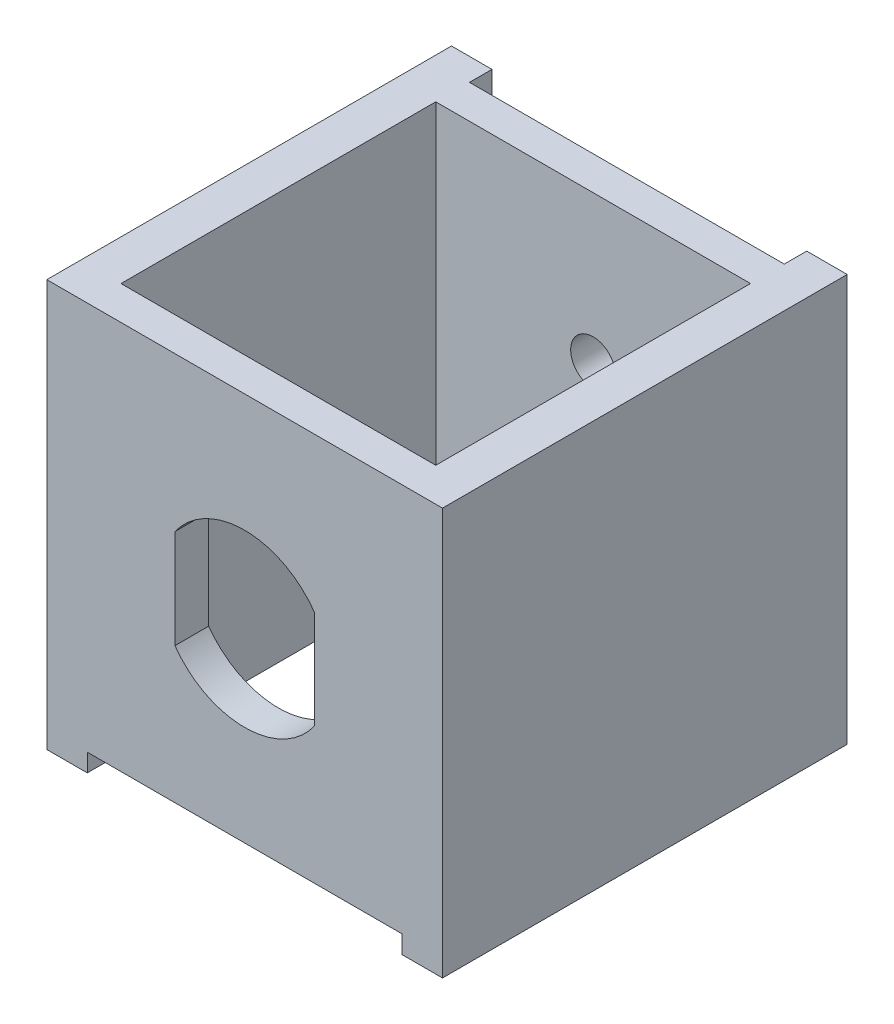
ISO-10303-21;
HEADER;
FILE_DESCRIPTION(('STEP AP214'),'2;1');
FILE_NAME('part.step','',(''),(''),'','','');
FILE_SCHEMA(('AUTOMOTIVE_DESIGN { 1 0 10303 214 1 1 1 1 }'));
ENDSEC;
DATA;
#1=APPLICATION_CONTEXT('core data for automotive mechanical design processes');
#2=APPLICATION_PROTOCOL_DEFINITION('international standard','automotive_design',2000,#1);
#3=PRODUCT_CONTEXT('',#1,'mechanical');
#4=PRODUCT('Part','Part','',(#3));
#5=PRODUCT_RELATED_PRODUCT_CATEGORY('part','',(#4));
#6=PRODUCT_DEFINITION_FORMATION('','',#4);
#7=PRODUCT_DEFINITION_CONTEXT('part definition',#1,'design');
#8=PRODUCT_DEFINITION('design','',#6,#7);
#9=PRODUCT_DEFINITION_SHAPE('','',#8);
#10=(LENGTH_UNIT() NAMED_UNIT(*) SI_UNIT(.MILLI.,.METRE.));
#11=(NAMED_UNIT(*) PLANE_ANGLE_UNIT() SI_UNIT($,.RADIAN.));
#12=(NAMED_UNIT(*) SI_UNIT($,.STERADIAN.) SOLID_ANGLE_UNIT());
#13=UNCERTAINTY_MEASURE_WITH_UNIT(LENGTH_MEASURE(1.E-05),#10,'distance_accuracy_value','');
#14=(GEOMETRIC_REPRESENTATION_CONTEXT(3) GLOBAL_UNCERTAINTY_ASSIGNED_CONTEXT((#13)) GLOBAL_UNIT_ASSIGNED_CONTEXT((#10,
#11,#12)) REPRESENTATION_CONTEXT('',''));
#15=CARTESIAN_POINT('',(0.,0.,0.));
#16=DIRECTION('',(0.,0.,1.));
#17=DIRECTION('',(1.,0.,0.));
#18=AXIS2_PLACEMENT_3D('',#15,#16,#17);
#19=CARTESIAN_POINT('',(-8.8,9.05,-18.));
#20=DIRECTION('',(-1.,0.,0.));
#21=DIRECTION('',(0.,-1.,0.));
#22=AXIS2_PLACEMENT_3D('',#19,#20,#21);
#23=PLANE('',#22);
#24=DIRECTION('',(0.,-1.,0.));
#25=VECTOR('',#24,1.);
#26=CARTESIAN_POINT('',(-8.8,9.05,0.));
#27=LINE('',#26,#25);
#28=CARTESIAN_POINT('',(-8.8,9.05,0.));
#29=VERTEX_POINT('',#28);
#30=CARTESIAN_POINT('',(-8.8,-9.05,0.));
#31=VERTEX_POINT('',#30);
#32=EDGE_CURVE('E246',#29,#31,#27,.T.);
#33=ORIENTED_EDGE('',*,*,#32,.F.);
#34=DIRECTION('',(0.,0.,1.));
#35=VECTOR('',#34,1.);
#36=CARTESIAN_POINT('',(-8.8,9.05,-18.));
#37=LINE('',#36,#35);
#38=CARTESIAN_POINT('',(-8.8,9.05,-18.));
#39=VERTEX_POINT('',#38);
#40=EDGE_CURVE('E257',#39,#29,#37,.T.);
#41=ORIENTED_EDGE('',*,*,#40,.F.);
#42=DIRECTION('',(0.,-1.,0.));
#43=VECTOR('',#42,1.);
#44=CARTESIAN_POINT('',(-8.8,9.05,-18.));
#45=LINE('',#44,#43);
#46=CARTESIAN_POINT('',(-8.8,-9.05,-18.));
#47=VERTEX_POINT('',#46);
#48=EDGE_CURVE('E235',#39,#47,#45,.T.);
#49=ORIENTED_EDGE('',*,*,#48,.T.);
#50=DIRECTION('',(0.,0.,1.));
#51=VECTOR('',#50,1.);
#52=CARTESIAN_POINT('',(-8.8,-9.05,-18.));
#53=LINE('',#52,#51);
#54=EDGE_CURVE('E255',#47,#31,#53,.T.);
#55=ORIENTED_EDGE('',*,*,#54,.T.);
#56=EDGE_LOOP('',(#33,#41,#49,#55));
#57=FACE_BOUND('',#56,.T.);
#58=DIRECTION('',(0.,0.,-1.));
#59=VECTOR('',#58,1.);
#60=CARTESIAN_POINT('',(-8.8,-1.5,-11.5));
#61=LINE('',#60,#59);
#62=CARTESIAN_POINT('',(-8.8,-1.5,-6.5));
#63=VERTEX_POINT('',#62);
#64=CARTESIAN_POINT('',(-8.8,-1.5,-11.5));
#65=VERTEX_POINT('',#64);
#66=EDGE_CURVE('E202',#63,#65,#61,.T.);
#67=ORIENTED_EDGE('',*,*,#66,.T.);
#68=DIRECTION('',(0.,1.,0.));
#69=VECTOR('',#68,1.);
#70=CARTESIAN_POINT('',(-8.8,1.5,-11.5));
#71=LINE('',#70,#69);
#72=CARTESIAN_POINT('',(-8.8,1.5,-11.5));
#73=VERTEX_POINT('',#72);
#74=EDGE_CURVE('E215',#65,#73,#71,.T.);
#75=ORIENTED_EDGE('',*,*,#74,.T.);
#76=DIRECTION('',(0.,0.,1.));
#77=VECTOR('',#76,1.);
#78=CARTESIAN_POINT('',(-8.8,1.5,-11.5));
#79=LINE('',#78,#77);
#80=CARTESIAN_POINT('',(-8.8,1.5,-6.5));
#81=VERTEX_POINT('',#80);
#82=EDGE_CURVE('E203',#73,#81,#79,.T.);
#83=ORIENTED_EDGE('',*,*,#82,.T.);
#84=DIRECTION('',(0.,-1.,0.));
#85=VECTOR('',#84,1.);
#86=CARTESIAN_POINT('',(-8.8,1.5,-6.5));
#87=LINE('',#86,#85);
#88=EDGE_CURVE('E194',#81,#63,#87,.T.);
#89=ORIENTED_EDGE('',*,*,#88,.T.);
#90=EDGE_LOOP('',(#67,#75,#83,#89));
#91=FACE_BOUND('',#90,.T.);
#92=ADVANCED_FACE('F34',(#57,#91),#23,.T.);
#93=CARTESIAN_POINT('',(0.,0.,-1.5));
#94=DIRECTION('',(0.,0.,1.));
#95=DIRECTION('',(1.,0.,0.));
#96=AXIS2_PLACEMENT_3D('',#93,#94,#95);
#97=PLANE('',#96);
#98=DIRECTION('',(0.,-1.,0.));
#99=VECTOR('',#98,1.);
#100=CARTESIAN_POINT('',(-3.1,2.1977260975836,-1.5));
#101=LINE('',#100,#99);
#102=CARTESIAN_POINT('',(-3.1,2.1977260975836,-1.5));
#103=VERTEX_POINT('',#102);
#104=CARTESIAN_POINT('',(-3.1,-2.19772609758359,-1.5));
#105=VERTEX_POINT('',#104);
#106=EDGE_CURVE('E339',#103,#105,#101,.T.);
#107=ORIENTED_EDGE('',*,*,#106,.T.);
#108=CARTESIAN_POINT('',(0.,0.,-1.5));
#109=DIRECTION('',(0.,0.,1.));
#110=DIRECTION('',(1.,0.,0.));
#111=AXIS2_PLACEMENT_3D('',#108,#109,#110);
#112=CIRCLE('',#111,3.8);
#113=CARTESIAN_POINT('',(3.1,-2.1977260975836,-1.5));
#114=VERTEX_POINT('',#113);
#115=EDGE_CURVE('E329',#105,#114,#112,.T.);
#116=ORIENTED_EDGE('',*,*,#115,.T.);
#117=DIRECTION('',(0.,1.,0.));
#118=VECTOR('',#117,1.);
#119=CARTESIAN_POINT('',(3.1,-2.1977260975836,-1.5));
#120=LINE('',#119,#118);
#121=CARTESIAN_POINT('',(3.1,2.19772609758359,-1.5));
#122=VERTEX_POINT('',#121);
#123=EDGE_CURVE('E332',#114,#122,#120,.T.);
#124=ORIENTED_EDGE('',*,*,#123,.T.);
#125=CARTESIAN_POINT('',(0.,0.,-1.5));
#126=DIRECTION('',(0.,0.,1.));
#127=DIRECTION('',(1.,0.,0.));
#128=AXIS2_PLACEMENT_3D('',#125,#126,#127);
#129=CIRCLE('',#128,3.8);
#130=EDGE_CURVE('E336',#122,#103,#129,.T.);
#131=ORIENTED_EDGE('',*,*,#130,.T.);
#132=EDGE_LOOP('',(#107,#116,#124,#131));
#133=FACE_BOUND('',#132,.T.);
#134=DIRECTION('',(-1.,0.,0.));
#135=VECTOR('',#134,1.);
#136=CARTESIAN_POINT('',(0.,9.05,-1.5));
#137=LINE('',#136,#135);
#138=CARTESIAN_POINT('',(7.,9.05,-1.5));
#139=VERTEX_POINT('',#138);
#140=CARTESIAN_POINT('',(-7.,9.05,-1.5));
#141=VERTEX_POINT('',#140);
#142=EDGE_CURVE('E270',#139,#141,#137,.T.);
#143=ORIENTED_EDGE('',*,*,#142,.F.);
#144=DIRECTION('',(0.,-1.,0.));
#145=VECTOR('',#144,1.);
#146=CARTESIAN_POINT('',(7.,0.,-1.5));
#147=LINE('',#146,#145);
#148=CARTESIAN_POINT('',(7.,-8.25,-1.5));
#149=VERTEX_POINT('',#148);
#150=EDGE_CURVE('E320',#139,#149,#147,.T.);
#151=ORIENTED_EDGE('',*,*,#150,.T.);
#152=DIRECTION('',(1.,0.,0.));
#153=VECTOR('',#152,1.);
#154=CARTESIAN_POINT('',(-7.,-8.25,-1.5));
#155=LINE('',#154,#153);
#156=CARTESIAN_POINT('',(-7.,-8.25,-1.5));
#157=VERTEX_POINT('',#156);
#158=EDGE_CURVE('E280',#157,#149,#155,.T.);
#159=ORIENTED_EDGE('',*,*,#158,.F.);
#160=DIRECTION('',(0.,1.,0.));
#161=VECTOR('',#160,1.);
#162=CARTESIAN_POINT('',(-7.,0.,-1.5));
#163=LINE('',#162,#161);
#164=EDGE_CURVE('E325',#157,#141,#163,.T.);
#165=ORIENTED_EDGE('',*,*,#164,.T.);
#166=EDGE_LOOP('',(#143,#151,#159,#165));
#167=FACE_BOUND('',#166,.T.);
#168=ADVANCED_FACE('F405',(#133,#167),#97,.F.);
#169=CARTESIAN_POINT('',(0.,0.,0.));
#170=DIRECTION('',(0.,0.,1.));
#171=DIRECTION('',(1.,0.,0.));
#172=AXIS2_PLACEMENT_3D('',#169,#170,#171);
#173=PLANE('',#172);
#174=CARTESIAN_POINT('',(0.,0.,0.));
#175=DIRECTION('',(0.,0.,1.));
#176=DIRECTION('',(1.,0.,0.));
#177=AXIS2_PLACEMENT_3D('',#174,#175,#176);
#178=CIRCLE('',#177,3.8);
#179=CARTESIAN_POINT('',(-3.1,-2.19772609758359,0.));
#180=VERTEX_POINT('',#179);
#181=CARTESIAN_POINT('',(3.1,-2.1977260975836,0.));
#182=VERTEX_POINT('',#181);
#183=EDGE_CURVE('E328',#180,#182,#178,.T.);
#184=ORIENTED_EDGE('',*,*,#183,.F.);
#185=DIRECTION('',(0.,-1.,0.));
#186=VECTOR('',#185,1.);
#187=CARTESIAN_POINT('',(-3.1,2.1977260975836,0.));
#188=LINE('',#187,#186);
#189=CARTESIAN_POINT('',(-3.1,2.1977260975836,0.));
#190=VERTEX_POINT('',#189);
#191=EDGE_CURVE('E333',#190,#180,#188,.T.);
#192=ORIENTED_EDGE('',*,*,#191,.F.);
#193=CARTESIAN_POINT('',(0.,0.,0.));
#194=DIRECTION('',(0.,0.,1.));
#195=DIRECTION('',(1.,0.,0.));
#196=AXIS2_PLACEMENT_3D('',#193,#194,#195);
#197=CIRCLE('',#196,3.8);
#198=CARTESIAN_POINT('',(3.1,2.19772609758359,0.));
#199=VERTEX_POINT('',#198);
#200=EDGE_CURVE('E347',#199,#190,#197,.T.);
#201=ORIENTED_EDGE('',*,*,#200,.F.);
#202=DIRECTION('',(0.,1.,0.));
#203=VECTOR('',#202,1.);
#204=CARTESIAN_POINT('',(3.1,-2.1977260975836,0.));
#205=LINE('',#204,#203);
#206=EDGE_CURVE('E344',#182,#199,#205,.T.);
#207=ORIENTED_EDGE('',*,*,#206,.F.);
#208=EDGE_LOOP('',(#184,#192,#201,#207));
#209=FACE_BOUND('',#208,.T.);
#210=DIRECTION('',(0.,-1.,0.));
#211=VECTOR('',#210,1.);
#212=CARTESIAN_POINT('',(7.,-8.25,0.));
#213=LINE('',#212,#211);
#214=CARTESIAN_POINT('',(7.,-8.25,0.));
#215=VERTEX_POINT('',#214);
#216=CARTESIAN_POINT('',(7.,-9.05,0.));
#217=VERTEX_POINT('',#216);
#218=EDGE_CURVE('E289',#215,#217,#213,.T.);
#219=ORIENTED_EDGE('',*,*,#218,.T.);
#220=DIRECTION('',(1.,0.,0.));
#221=VECTOR('',#220,1.);
#222=CARTESIAN_POINT('',(-8.8,-9.05,0.));
#223=LINE('',#222,#221);
#224=CARTESIAN_POINT('',(8.8,-9.05,0.));
#225=VERTEX_POINT('',#224);
#226=EDGE_CURVE('E249',#217,#225,#223,.T.);
#227=ORIENTED_EDGE('',*,*,#226,.T.);
#228=DIRECTION('',(0.,1.,0.));
#229=VECTOR('',#228,1.);
#230=CARTESIAN_POINT('',(8.8,-9.05,0.));
#231=LINE('',#230,#229);
#232=CARTESIAN_POINT('',(8.8,9.05,0.));
#233=VERTEX_POINT('',#232);
#234=EDGE_CURVE('E223',#225,#233,#231,.T.);
#235=ORIENTED_EDGE('',*,*,#234,.T.);
#236=DIRECTION('',(-1.,0.,0.));
#237=VECTOR('',#236,1.);
#238=CARTESIAN_POINT('',(8.8,9.05,0.));
#239=LINE('',#238,#237);
#240=EDGE_CURVE('E243',#233,#29,#239,.T.);
#241=ORIENTED_EDGE('',*,*,#240,.T.);
#242=ORIENTED_EDGE('',*,*,#32,.T.);
#243=CARTESIAN_POINT('',(-7.,-9.05,0.));
#244=VERTEX_POINT('',#243);
#245=EDGE_CURVE('E232',#31,#244,#223,.T.);
#246=ORIENTED_EDGE('',*,*,#245,.T.);
#247=DIRECTION('',(0.,-1.,0.));
#248=VECTOR('',#247,1.);
#249=CARTESIAN_POINT('',(-7.,-8.25,0.));
#250=LINE('',#249,#248);
#251=CARTESIAN_POINT('',(-7.,-8.25,0.));
#252=VERTEX_POINT('',#251);
#253=EDGE_CURVE('E290',#252,#244,#250,.T.);
#254=ORIENTED_EDGE('',*,*,#253,.F.);
#255=DIRECTION('',(-1.,0.,0.));
#256=VECTOR('',#255,1.);
#257=CARTESIAN_POINT('',(-7.,-8.25,0.));
#258=LINE('',#257,#256);
#259=EDGE_CURVE('E286',#215,#252,#258,.T.);
#260=ORIENTED_EDGE('',*,*,#259,.F.);
#261=EDGE_LOOP('',(#219,#227,#235,#241,#242,#246,#254,#260));
#262=FACE_BOUND('',#261,.T.);
#263=ADVANCED_FACE('F411',(#209,#262),#173,.T.);
#264=CARTESIAN_POINT('',(-7.,9.25,-18.));
#265=DIRECTION('',(1.,0.,0.));
#266=DIRECTION('',(0.,1.,0.));
#267=AXIS2_PLACEMENT_3D('',#264,#265,#266);
#268=PLANE('',#267);
#269=ORIENTED_EDGE('',*,*,#253,.T.);
#270=DIRECTION('',(0.,0.,-1.));
#271=VECTOR('',#270,1.);
#272=CARTESIAN_POINT('',(-7.,-9.05,-18.));
#273=LINE('',#272,#271);
#274=CARTESIAN_POINT('',(-7.,-9.05,-18.));
#275=VERTEX_POINT('',#274);
#276=EDGE_CURVE('E275',#244,#275,#273,.T.);
#277=ORIENTED_EDGE('',*,*,#276,.T.);
#278=DIRECTION('',(0.,1.,0.));
#279=VECTOR('',#278,1.);
#280=CARTESIAN_POINT('',(-7.,9.25,-18.));
#281=LINE('',#280,#279);
#282=CARTESIAN_POINT('',(-7.,9.05,-18.));
#283=VERTEX_POINT('',#282);
#284=EDGE_CURVE('E322',#275,#283,#281,.T.);
#285=ORIENTED_EDGE('',*,*,#284,.T.);
#286=DIRECTION('',(0.,0.,1.));
#287=VECTOR('',#286,1.);
#288=CARTESIAN_POINT('',(-7.,9.05,-18.));
#289=LINE('',#288,#287);
#290=CARTESIAN_POINT('',(-7.,9.05,-17.));
#291=VERTEX_POINT('',#290);
#292=EDGE_CURVE('E262',#283,#291,#289,.T.);
#293=ORIENTED_EDGE('',*,*,#292,.T.);
#294=DIRECTION('',(0.,1.,0.));
#295=VECTOR('',#294,1.);
#296=CARTESIAN_POINT('',(-7.,9.25,-17.));
#297=LINE('',#296,#295);
#298=CARTESIAN_POINT('',(-7.,-5.75,-17.));
#299=VERTEX_POINT('',#298);
#300=EDGE_CURVE('E312',#299,#291,#297,.T.);
#301=ORIENTED_EDGE('',*,*,#300,.F.);
#302=DIRECTION('',(0.,0.,-1.));
#303=VECTOR('',#302,1.);
#304=CARTESIAN_POINT('',(-7.,-5.75,-18.));
#305=LINE('',#304,#303);
#306=CARTESIAN_POINT('',(-7.,-5.75,-15.5));
#307=VERTEX_POINT('',#306);
#308=EDGE_CURVE('E309',#307,#299,#305,.T.);
#309=ORIENTED_EDGE('',*,*,#308,.F.);
#310=DIRECTION('',(0.,-1.,0.));
#311=VECTOR('',#310,1.);
#312=CARTESIAN_POINT('',(-7.,9.25,-15.5));
#313=LINE('',#312,#311);
#314=CARTESIAN_POINT('',(-7.,9.05,-15.5));
#315=VERTEX_POINT('',#314);
#316=EDGE_CURVE('E315',#315,#307,#313,.T.);
#317=ORIENTED_EDGE('',*,*,#316,.F.);
#318=EDGE_CURVE('E267',#315,#141,#289,.T.);
#319=ORIENTED_EDGE('',*,*,#318,.T.);
#320=ORIENTED_EDGE('',*,*,#164,.F.);
#321=DIRECTION('',(0.,0.,-1.));
#322=VECTOR('',#321,1.);
#323=CARTESIAN_POINT('',(-7.,-8.25,-1.5));
#324=LINE('',#323,#322);
#325=EDGE_CURVE('E278',#252,#157,#324,.T.);
#326=ORIENTED_EDGE('',*,*,#325,.F.);
#327=EDGE_LOOP('',(#269,#277,#285,#293,#301,#309,#317,#319,#320,#326));
#328=FACE_BOUND('',#327,.T.);
#329=ADVANCED_FACE('F465',(#328),#268,.T.);
#330=CARTESIAN_POINT('',(0.,0.,-18.));
#331=DIRECTION('',(0.,0.,1.));
#332=DIRECTION('',(1.,0.,0.));
#333=AXIS2_PLACEMENT_3D('',#330,#331,#332);
#334=PLANE('',#333);
#335=DIRECTION('',(1.,0.,0.));
#336=VECTOR('',#335,1.);
#337=CARTESIAN_POINT('',(-8.8,-9.05,-18.));
#338=LINE('',#337,#336);
#339=EDGE_CURVE('E238',#47,#275,#338,.T.);
#340=ORIENTED_EDGE('',*,*,#339,.F.);
#341=ORIENTED_EDGE('',*,*,#48,.F.);
#342=DIRECTION('',(-1.,0.,0.));
#343=VECTOR('',#342,1.);
#344=CARTESIAN_POINT('',(8.8,9.05,-18.));
#345=LINE('',#344,#343);
#346=EDGE_CURVE('E231',#283,#39,#345,.T.);
#347=ORIENTED_EDGE('',*,*,#346,.F.);
#348=ORIENTED_EDGE('',*,*,#284,.F.);
#349=EDGE_LOOP('',(#340,#341,#347,#348));
#350=FACE_BOUND('',#349,.T.);
#351=ADVANCED_FACE('F461',(#350),#334,.F.);
#352=CARTESIAN_POINT('',(7.,9.25,-18.));
#353=DIRECTION('',(-1.,0.,0.));
#354=DIRECTION('',(0.,-1.,0.));
#355=AXIS2_PLACEMENT_3D('',#352,#353,#354);
#356=PLANE('',#355);
#357=DIRECTION('',(0.,-1.,0.));
#358=VECTOR('',#357,1.);
#359=CARTESIAN_POINT('',(7.,9.25,-18.));
#360=LINE('',#359,#358);
#361=CARTESIAN_POINT('',(7.,9.05,-18.));
#362=VERTEX_POINT('',#361);
#363=CARTESIAN_POINT('',(7.,-9.05,-18.));
#364=VERTEX_POINT('',#363);
#365=EDGE_CURVE('E317',#362,#364,#360,.T.);
#366=ORIENTED_EDGE('',*,*,#365,.T.);
#367=DIRECTION('',(0.,0.,1.));
#368=VECTOR('',#367,1.);
#369=CARTESIAN_POINT('',(7.,-9.05,-18.));
#370=LINE('',#369,#368);
#371=EDGE_CURVE('E272',#364,#217,#370,.T.);
#372=ORIENTED_EDGE('',*,*,#371,.T.);
#373=ORIENTED_EDGE('',*,*,#218,.F.);
#374=DIRECTION('',(0.,0.,1.));
#375=VECTOR('',#374,1.);
#376=CARTESIAN_POINT('',(7.,-8.25,-1.5));
#377=LINE('',#376,#375);
#378=EDGE_CURVE('E283',#149,#215,#377,.T.);
#379=ORIENTED_EDGE('',*,*,#378,.F.);
#380=ORIENTED_EDGE('',*,*,#150,.F.);
#381=DIRECTION('',(0.,0.,-1.));
#382=VECTOR('',#381,1.);
#383=CARTESIAN_POINT('',(7.,9.05,-18.));
#384=LINE('',#383,#382);
#385=CARTESIAN_POINT('',(7.,9.05,-15.5));
#386=VERTEX_POINT('',#385);
#387=EDGE_CURVE('E263',#139,#386,#384,.T.);
#388=ORIENTED_EDGE('',*,*,#387,.T.);
#389=DIRECTION('',(0.,1.,0.));
#390=VECTOR('',#389,1.);
#391=CARTESIAN_POINT('',(7.,9.25,-15.5));
#392=LINE('',#391,#390);
#393=CARTESIAN_POINT('',(7.,-5.75,-15.5));
#394=VERTEX_POINT('',#393);
#395=EDGE_CURVE('E364',#394,#386,#392,.T.);
#396=ORIENTED_EDGE('',*,*,#395,.F.);
#397=DIRECTION('',(0.,0.,1.));
#398=VECTOR('',#397,1.);
#399=CARTESIAN_POINT('',(7.,-5.75,-18.));
#400=LINE('',#399,#398);
#401=CARTESIAN_POINT('',(7.,-5.75,-17.));
#402=VERTEX_POINT('',#401);
#403=EDGE_CURVE('E354',#402,#394,#400,.T.);
#404=ORIENTED_EDGE('',*,*,#403,.F.);
#405=DIRECTION('',(0.,-1.,0.));
#406=VECTOR('',#405,1.);
#407=CARTESIAN_POINT('',(7.,9.25,-17.));
#408=LINE('',#407,#406);
#409=CARTESIAN_POINT('',(7.,9.05,-17.));
#410=VERTEX_POINT('',#409);
#411=EDGE_CURVE('E362',#410,#402,#408,.T.);
#412=ORIENTED_EDGE('',*,*,#411,.F.);
#413=EDGE_CURVE('E254',#410,#362,#384,.T.);
#414=ORIENTED_EDGE('',*,*,#413,.T.);
#415=EDGE_LOOP('',(#366,#372,#373,#379,#380,#388,#396,#404,#412,#414));
#416=FACE_BOUND('',#415,.T.);
#417=ADVANCED_FACE('F457',(#416),#356,.T.);
#418=CARTESIAN_POINT('',(0.,0.,-18.));
#419=DIRECTION('',(0.,0.,1.));
#420=DIRECTION('',(1.,0.,0.));
#421=AXIS2_PLACEMENT_3D('',#418,#419,#420);
#422=PLANE('',#421);
#423=DIRECTION('',(1.,0.,0.));
#424=VECTOR('',#423,1.);
#425=CARTESIAN_POINT('',(0.,-9.05,-18.));
#426=LINE('',#425,#424);
#427=CARTESIAN_POINT('',(8.8,-9.05,-18.));
#428=VERTEX_POINT('',#427);
#429=EDGE_CURVE('E374',#364,#428,#426,.T.);
#430=ORIENTED_EDGE('',*,*,#429,.F.);
#431=ORIENTED_EDGE('',*,*,#365,.F.);
#432=CARTESIAN_POINT('',(8.8,9.05,-18.));
#433=VERTEX_POINT('',#432);
#434=EDGE_CURVE('E233',#433,#362,#345,.T.);
#435=ORIENTED_EDGE('',*,*,#434,.F.);
#436=DIRECTION('',(0.,1.,0.));
#437=VECTOR('',#436,1.);
#438=CARTESIAN_POINT('',(8.8,-9.05,-18.));
#439=LINE('',#438,#437);
#440=EDGE_CURVE('E228',#428,#433,#439,.T.);
#441=ORIENTED_EDGE('',*,*,#440,.F.);
#442=EDGE_LOOP('',(#430,#431,#435,#441));
#443=FACE_BOUND('',#442,.T.);
#444=ADVANCED_FACE('F449',(#443),#422,.F.);
#445=CARTESIAN_POINT('',(9.,-5.75,-15.5));
#446=DIRECTION('',(0.,0.,1.));
#447=DIRECTION('',(1.,0.,0.));
#448=AXIS2_PLACEMENT_3D('',#445,#446,#447);
#449=PLANE('',#448);
#450=CARTESIAN_POINT('',(0.,2.5,-15.5));
#451=DIRECTION('',(0.,0.,-1.));
#452=DIRECTION('',(-1.,0.,0.));
#453=AXIS2_PLACEMENT_3D('',#450,#451,#452);
#454=CIRCLE('',#453,1.);
#455=CARTESIAN_POINT('',(-1.,2.5,-15.5));
#456=VERTEX_POINT('',#455);
#457=EDGE_CURVE('E296',#456,#456,#454,.T.);
#458=ORIENTED_EDGE('',*,*,#457,.T.);
#459=EDGE_LOOP('',(#458));
#460=FACE_BOUND('',#459,.T.);
#461=CARTESIAN_POINT('',(0.,-2.5,-15.5));
#462=DIRECTION('',(0.,0.,-1.));
#463=DIRECTION('',(-1.,0.,0.));
#464=AXIS2_PLACEMENT_3D('',#461,#462,#463);
#465=CIRCLE('',#464,1.);
#466=CARTESIAN_POINT('',(-1.,-2.5,-15.5));
#467=VERTEX_POINT('',#466);
#468=EDGE_CURVE('E293',#467,#467,#465,.T.);
#469=ORIENTED_EDGE('',*,*,#468,.T.);
#470=EDGE_LOOP('',(#469));
#471=FACE_BOUND('',#470,.T.);
#472=ORIENTED_EDGE('',*,*,#395,.T.);
#473=DIRECTION('',(-1.,0.,0.));
#474=VECTOR('',#473,1.);
#475=CARTESIAN_POINT('',(9.,9.05,-15.5));
#476=LINE('',#475,#474);
#477=EDGE_CURVE('E266',#386,#315,#476,.T.);
#478=ORIENTED_EDGE('',*,*,#477,.T.);
#479=ORIENTED_EDGE('',*,*,#316,.T.);
#480=DIRECTION('',(1.,0.,0.));
#481=VECTOR('',#480,1.);
#482=CARTESIAN_POINT('',(9.,-5.75,-15.5));
#483=LINE('',#482,#481);
#484=EDGE_CURVE('E305',#307,#394,#483,.T.);
#485=ORIENTED_EDGE('',*,*,#484,.T.);
#486=EDGE_LOOP('',(#472,#478,#479,#485));
#487=FACE_BOUND('',#486,.T.);
#488=ADVANCED_FACE('F445',(#460,#471,#487),#449,.T.);
#489=CARTESIAN_POINT('',(9.,-5.75,-17.));
#490=DIRECTION('',(0.,0.,-1.));
#491=DIRECTION('',(-1.,0.,0.));
#492=AXIS2_PLACEMENT_3D('',#489,#490,#491);
#493=PLANE('',#492);
#494=CARTESIAN_POINT('',(0.,2.5,-17.));
#495=DIRECTION('',(0.,0.,-1.));
#496=DIRECTION('',(-1.,0.,0.));
#497=AXIS2_PLACEMENT_3D('',#494,#495,#496);
#498=CIRCLE('',#497,1.);
#499=CARTESIAN_POINT('',(-1.,2.5,-17.));
#500=VERTEX_POINT('',#499);
#501=EDGE_CURVE('E306',#500,#500,#498,.F.);
#502=ORIENTED_EDGE('',*,*,#501,.T.);
#503=EDGE_LOOP('',(#502));
#504=FACE_BOUND('',#503,.T.);
#505=CARTESIAN_POINT('',(0.,-2.5,-17.));
#506=DIRECTION('',(0.,0.,-1.));
#507=DIRECTION('',(-1.,0.,0.));
#508=AXIS2_PLACEMENT_3D('',#505,#506,#507);
#509=CIRCLE('',#508,1.);
#510=CARTESIAN_POINT('',(-1.,-2.5,-17.));
#511=VERTEX_POINT('',#510);
#512=EDGE_CURVE('E299',#511,#511,#509,.F.);
#513=ORIENTED_EDGE('',*,*,#512,.T.);
#514=EDGE_LOOP('',(#513));
#515=FACE_BOUND('',#514,.T.);
#516=ORIENTED_EDGE('',*,*,#300,.T.);
#517=DIRECTION('',(1.,0.,0.));
#518=VECTOR('',#517,1.);
#519=CARTESIAN_POINT('',(9.,9.05,-17.));
#520=LINE('',#519,#518);
#521=EDGE_CURVE('E367',#291,#410,#520,.T.);
#522=ORIENTED_EDGE('',*,*,#521,.T.);
#523=ORIENTED_EDGE('',*,*,#411,.T.);
#524=DIRECTION('',(-1.,0.,0.));
#525=VECTOR('',#524,1.);
#526=CARTESIAN_POINT('',(9.,-5.75,-17.));
#527=LINE('',#526,#525);
#528=EDGE_CURVE('E302',#402,#299,#527,.T.);
#529=ORIENTED_EDGE('',*,*,#528,.T.);
#530=EDGE_LOOP('',(#516,#522,#523,#529));
#531=FACE_BOUND('',#530,.T.);
#532=ADVANCED_FACE('F448',(#504,#515,#531),#493,.T.);
#533=CARTESIAN_POINT('',(0.,0.,-1.5));
#534=DIRECTION('',(0.,0.,1.));
#535=DIRECTION('',(1.,0.,0.));
#536=AXIS2_PLACEMENT_3D('',#533,#534,#535);
#537=CYLINDRICAL_SURFACE('',#536,3.8);
#538=ORIENTED_EDGE('',*,*,#183,.T.);
#539=DIRECTION('',(0.,0.,1.));
#540=VECTOR('',#539,1.);
#541=CARTESIAN_POINT('',(3.1,-2.1977260975836,-1.5));
#542=LINE('',#541,#540);
#543=EDGE_CURVE('E342',#114,#182,#542,.T.);
#544=ORIENTED_EDGE('',*,*,#543,.F.);
#545=ORIENTED_EDGE('',*,*,#115,.F.);
#546=DIRECTION('',(0.,0.,1.));
#547=VECTOR('',#546,1.);
#548=CARTESIAN_POINT('',(-3.1,-2.19772609758359,-1.5));
#549=LINE('',#548,#547);
#550=EDGE_CURVE('E352',#105,#180,#549,.T.);
#551=ORIENTED_EDGE('',*,*,#550,.T.);
#552=EDGE_LOOP('',(#538,#544,#545,#551));
#553=FACE_BOUND('',#552,.T.);
#554=ADVANCED_FACE('F453',(#553),#537,.F.);
#555=CARTESIAN_POINT('',(-3.1,2.1977260975836,-1.5));
#556=DIRECTION('',(-1.,0.,0.));
#557=DIRECTION('',(0.,-1.,0.));
#558=AXIS2_PLACEMENT_3D('',#555,#556,#557);
#559=PLANE('',#558);
#560=ORIENTED_EDGE('',*,*,#191,.T.);
#561=ORIENTED_EDGE('',*,*,#550,.F.);
#562=ORIENTED_EDGE('',*,*,#106,.F.);
#563=DIRECTION('',(0.,0.,1.));
#564=VECTOR('',#563,1.);
#565=CARTESIAN_POINT('',(-3.1,2.1977260975836,-1.5));
#566=LINE('',#565,#564);
#567=EDGE_CURVE('E355',#103,#190,#566,.T.);
#568=ORIENTED_EDGE('',*,*,#567,.T.);
#569=EDGE_LOOP('',(#560,#561,#562,#568));
#570=FACE_BOUND('',#569,.T.);
#571=ADVANCED_FACE('F470',(#570),#559,.F.);
#572=CARTESIAN_POINT('',(0.,0.,-1.5));
#573=DIRECTION('',(0.,0.,1.));
#574=DIRECTION('',(1.,0.,0.));
#575=AXIS2_PLACEMENT_3D('',#572,#573,#574);
#576=CYLINDRICAL_SURFACE('',#575,3.8);
#577=ORIENTED_EDGE('',*,*,#200,.T.);
#578=ORIENTED_EDGE('',*,*,#567,.F.);
#579=ORIENTED_EDGE('',*,*,#130,.F.);
#580=DIRECTION('',(0.,0.,1.));
#581=VECTOR('',#580,1.);
#582=CARTESIAN_POINT('',(3.1,2.19772609758359,-1.5));
#583=LINE('',#582,#581);
#584=EDGE_CURVE('E357',#122,#199,#583,.T.);
#585=ORIENTED_EDGE('',*,*,#584,.T.);
#586=EDGE_LOOP('',(#577,#578,#579,#585));
#587=FACE_BOUND('',#586,.T.);
#588=ADVANCED_FACE('F473',(#587),#576,.F.);
#589=CARTESIAN_POINT('',(3.1,-2.1977260975836,-1.5));
#590=DIRECTION('',(1.,0.,0.));
#591=DIRECTION('',(0.,1.,0.));
#592=AXIS2_PLACEMENT_3D('',#589,#590,#591);
#593=PLANE('',#592);
#594=ORIENTED_EDGE('',*,*,#206,.T.);
#595=ORIENTED_EDGE('',*,*,#584,.F.);
#596=ORIENTED_EDGE('',*,*,#123,.F.);
#597=ORIENTED_EDGE('',*,*,#543,.T.);
#598=EDGE_LOOP('',(#594,#595,#596,#597));
#599=FACE_BOUND('',#598,.T.);
#600=ADVANCED_FACE('F443',(#599),#593,.F.);
#601=CARTESIAN_POINT('',(0.,-5.75,0.));
#602=DIRECTION('',(0.,-1.,0.));
#603=DIRECTION('',(0.,0.,-1.));
#604=AXIS2_PLACEMENT_3D('',#601,#602,#603);
#605=PLANE('',#604);
#606=ORIENTED_EDGE('',*,*,#484,.F.);
#607=ORIENTED_EDGE('',*,*,#308,.T.);
#608=ORIENTED_EDGE('',*,*,#528,.F.);
#609=ORIENTED_EDGE('',*,*,#403,.T.);
#610=EDGE_LOOP('',(#606,#607,#608,#609));
#611=FACE_BOUND('',#610,.T.);
#612=ADVANCED_FACE('F439',(#611),#605,.T.);
#613=CARTESIAN_POINT('',(0.,-2.5,-18.));
#614=DIRECTION('',(0.,0.,1.));
#615=DIRECTION('',(1.,0.,0.));
#616=AXIS2_PLACEMENT_3D('',#613,#614,#615);
#617=CYLINDRICAL_SURFACE('',#616,1.);
#618=ORIENTED_EDGE('',*,*,#512,.F.);
#619=EDGE_LOOP('',(#618));
#620=FACE_BOUND('',#619,.T.);
#621=ORIENTED_EDGE('',*,*,#468,.F.);
#622=EDGE_LOOP('',(#621));
#623=FACE_BOUND('',#622,.T.);
#624=ADVANCED_FACE('F435',(#620,#623),#617,.F.);
#625=CARTESIAN_POINT('',(0.,2.5,-18.));
#626=DIRECTION('',(0.,0.,1.));
#627=DIRECTION('',(1.,0.,0.));
#628=AXIS2_PLACEMENT_3D('',#625,#626,#627);
#629=CYLINDRICAL_SURFACE('',#628,1.);
#630=ORIENTED_EDGE('',*,*,#501,.F.);
#631=EDGE_LOOP('',(#630));
#632=FACE_BOUND('',#631,.T.);
#633=ORIENTED_EDGE('',*,*,#457,.F.);
#634=EDGE_LOOP('',(#633));
#635=FACE_BOUND('',#634,.T.);
#636=ADVANCED_FACE('F431',(#632,#635),#629,.F.);
#637=CARTESIAN_POINT('',(0.,-8.25,0.));
#638=DIRECTION('',(0.,1.,0.));
#639=DIRECTION('',(0.,0.,1.));
#640=AXIS2_PLACEMENT_3D('',#637,#638,#639);
#641=PLANE('',#640);
#642=ORIENTED_EDGE('',*,*,#325,.T.);
#643=ORIENTED_EDGE('',*,*,#158,.T.);
#644=ORIENTED_EDGE('',*,*,#378,.T.);
#645=ORIENTED_EDGE('',*,*,#259,.T.);
#646=EDGE_LOOP('',(#642,#643,#644,#645));
#647=FACE_BOUND('',#646,.T.);
#648=ADVANCED_FACE('F428',(#647),#641,.F.);
#649=CARTESIAN_POINT('',(-8.8,-9.05,-18.));
#650=DIRECTION('',(0.,-1.,0.));
#651=DIRECTION('',(0.,0.,-1.));
#652=AXIS2_PLACEMENT_3D('',#649,#650,#651);
#653=PLANE('',#652);
#654=ORIENTED_EDGE('',*,*,#245,.F.);
#655=ORIENTED_EDGE('',*,*,#54,.F.);
#656=ORIENTED_EDGE('',*,*,#339,.T.);
#657=ORIENTED_EDGE('',*,*,#276,.F.);
#658=EDGE_LOOP('',(#654,#655,#656,#657));
#659=FACE_BOUND('',#658,.T.);
#660=ADVANCED_FACE('F423',(#659),#653,.T.);
#661=CARTESIAN_POINT('',(8.8,9.05,-18.));
#662=DIRECTION('',(0.,1.,0.));
#663=DIRECTION('',(0.,0.,1.));
#664=AXIS2_PLACEMENT_3D('',#661,#662,#663);
#665=PLANE('',#664);
#666=ORIENTED_EDGE('',*,*,#346,.T.);
#667=ORIENTED_EDGE('',*,*,#40,.T.);
#668=ORIENTED_EDGE('',*,*,#240,.F.);
#669=DIRECTION('',(0.,0.,1.));
#670=VECTOR('',#669,1.);
#671=CARTESIAN_POINT('',(8.8,9.05,-18.));
#672=LINE('',#671,#670);
#673=EDGE_CURVE('E240',#433,#233,#672,.T.);
#674=ORIENTED_EDGE('',*,*,#673,.F.);
#675=ORIENTED_EDGE('',*,*,#434,.T.);
#676=ORIENTED_EDGE('',*,*,#413,.F.);
#677=ORIENTED_EDGE('',*,*,#521,.F.);
#678=ORIENTED_EDGE('',*,*,#292,.F.);
#679=EDGE_LOOP('',(#666,#667,#668,#674,#675,#676,#677,#678));
#680=FACE_BOUND('',#679,.T.);
#681=ORIENTED_EDGE('',*,*,#142,.T.);
#682=ORIENTED_EDGE('',*,*,#318,.F.);
#683=ORIENTED_EDGE('',*,*,#477,.F.);
#684=ORIENTED_EDGE('',*,*,#387,.F.);
#685=EDGE_LOOP('',(#681,#682,#683,#684));
#686=FACE_BOUND('',#685,.T.);
#687=ADVANCED_FACE('F419',(#680,#686),#665,.T.);
#688=CARTESIAN_POINT('',(8.8,-9.05,-18.));
#689=DIRECTION('',(1.,0.,0.));
#690=DIRECTION('',(0.,1.,0.));
#691=AXIS2_PLACEMENT_3D('',#688,#689,#690);
#692=PLANE('',#691);
#693=ORIENTED_EDGE('',*,*,#234,.F.);
#694=DIRECTION('',(0.,0.,1.));
#695=VECTOR('',#694,1.);
#696=CARTESIAN_POINT('',(8.8,-9.05,-18.));
#697=LINE('',#696,#695);
#698=EDGE_CURVE('E252',#428,#225,#697,.T.);
#699=ORIENTED_EDGE('',*,*,#698,.F.);
#700=ORIENTED_EDGE('',*,*,#440,.T.);
#701=ORIENTED_EDGE('',*,*,#673,.T.);
#702=EDGE_LOOP('',(#693,#699,#700,#701));
#703=FACE_BOUND('',#702,.T.);
#704=ADVANCED_FACE('F422',(#703),#692,.T.);
#705=ORIENTED_EDGE('',*,*,#429,.T.);
#706=ORIENTED_EDGE('',*,*,#698,.T.);
#707=ORIENTED_EDGE('',*,*,#226,.F.);
#708=ORIENTED_EDGE('',*,*,#371,.F.);
#709=EDGE_LOOP('',(#705,#706,#707,#708));
#710=FACE_BOUND('',#709,.T.);
#711=ADVANCED_FACE('F417',(#710),#653,.T.);
#712=CARTESIAN_POINT('',(8.802,-1.5,-11.5));
#713=DIRECTION('',(0.,-1.,0.));
#714=DIRECTION('',(0.,0.,-1.));
#715=AXIS2_PLACEMENT_3D('',#712,#713,#714);
#716=PLANE('',#715);
#717=DIRECTION('',(-1.,0.,0.));
#718=VECTOR('',#717,1.);
#719=CARTESIAN_POINT('',(8.802,-1.5,-6.5));
#720=LINE('',#719,#718);
#721=CARTESIAN_POINT('',(-10.1,-1.5,-6.5));
#722=VERTEX_POINT('',#721);
#723=EDGE_CURVE('E198',#63,#722,#720,.T.);
#724=ORIENTED_EDGE('',*,*,#723,.T.);
#725=CARTESIAN_POINT('',(-10.1,-1.5,-6.9));
#726=DIRECTION('',(0.,-1.,0.));
#727=DIRECTION('',(0.,0.,-1.));
#728=AXIS2_PLACEMENT_3D('',#725,#726,#727);
#729=CIRCLE('',#728,0.4);
#730=CARTESIAN_POINT('',(-10.5,-1.5,-6.9));
#731=VERTEX_POINT('',#730);
#732=EDGE_CURVE('E42',#722,#731,#729,.T.);
#733=ORIENTED_EDGE('',*,*,#732,.T.);
#734=DIRECTION('',(0.,0.,1.));
#735=VECTOR('',#734,1.);
#736=CARTESIAN_POINT('',(-10.5,-1.5,-11.5));
#737=LINE('',#736,#735);
#738=CARTESIAN_POINT('',(-10.5,-1.5,-11.1));
#739=VERTEX_POINT('',#738);
#740=EDGE_CURVE('E219',#739,#731,#737,.T.);
#741=ORIENTED_EDGE('',*,*,#740,.F.);
#742=CARTESIAN_POINT('',(-10.1,-1.5,-11.1));
#743=DIRECTION('',(0.,-1.,0.));
#744=DIRECTION('',(0.,0.,-1.));
#745=AXIS2_PLACEMENT_3D('',#742,#743,#744);
#746=CIRCLE('',#745,0.4);
#747=CARTESIAN_POINT('',(-10.1,-1.5,-11.5));
#748=VERTEX_POINT('',#747);
#749=EDGE_CURVE('E49',#739,#748,#746,.T.);
#750=ORIENTED_EDGE('',*,*,#749,.T.);
#751=DIRECTION('',(-1.,0.,0.));
#752=VECTOR('',#751,1.);
#753=CARTESIAN_POINT('',(8.802,-1.5,-11.5));
#754=LINE('',#753,#752);
#755=EDGE_CURVE('E226',#65,#748,#754,.T.);
#756=ORIENTED_EDGE('',*,*,#755,.F.);
#757=ORIENTED_EDGE('',*,*,#66,.F.);
#758=EDGE_LOOP('',(#724,#733,#741,#750,#756,#757));
#759=FACE_BOUND('',#758,.T.);
#760=ADVANCED_FACE('F388',(#759),#716,.T.);
#761=CARTESIAN_POINT('',(8.802,1.5,-6.5));
#762=DIRECTION('',(0.,0.,1.));
#763=DIRECTION('',(1.,0.,0.));
#764=AXIS2_PLACEMENT_3D('',#761,#762,#763);
#765=PLANE('',#764);
#766=DIRECTION('',(-1.,0.,0.));
#767=VECTOR('',#766,1.);
#768=CARTESIAN_POINT('',(8.802,1.5,-6.5));
#769=LINE('',#768,#767);
#770=CARTESIAN_POINT('',(-10.1,1.5,-6.5));
#771=VERTEX_POINT('',#770);
#772=EDGE_CURVE('E197',#81,#771,#769,.T.);
#773=ORIENTED_EDGE('',*,*,#772,.T.);
#774=DIRECTION('',(0.,1.,0.));
#775=VECTOR('',#774,1.);
#776=CARTESIAN_POINT('',(-10.1,1.5,-6.5));
#777=LINE('',#776,#775);
#778=EDGE_CURVE('E57',#771,#722,#777,.F.);
#779=ORIENTED_EDGE('',*,*,#778,.T.);
#780=ORIENTED_EDGE('',*,*,#723,.F.);
#781=ORIENTED_EDGE('',*,*,#88,.F.);
#782=EDGE_LOOP('',(#773,#779,#780,#781));
#783=FACE_BOUND('',#782,.T.);
#784=ADVANCED_FACE('F196',(#783),#765,.T.);
#785=CARTESIAN_POINT('',(8.802,1.5,-11.5));
#786=DIRECTION('',(0.,0.,-1.));
#787=DIRECTION('',(-1.,0.,0.));
#788=AXIS2_PLACEMENT_3D('',#785,#786,#787);
#789=PLANE('',#788);
#790=ORIENTED_EDGE('',*,*,#755,.T.);
#791=DIRECTION('',(0.,-1.,0.));
#792=VECTOR('',#791,1.);
#793=CARTESIAN_POINT('',(-10.1,1.5,-11.5));
#794=LINE('',#793,#792);
#795=CARTESIAN_POINT('',(-10.1,1.5,-11.5));
#796=VERTEX_POINT('',#795);
#797=EDGE_CURVE('E11',#748,#796,#794,.F.);
#798=ORIENTED_EDGE('',*,*,#797,.T.);
#799=DIRECTION('',(-1.,0.,0.));
#800=VECTOR('',#799,1.);
#801=CARTESIAN_POINT('',(8.802,1.5,-11.5));
#802=LINE('',#801,#800);
#803=EDGE_CURVE('E211',#73,#796,#802,.T.);
#804=ORIENTED_EDGE('',*,*,#803,.F.);
#805=ORIENTED_EDGE('',*,*,#74,.F.);
#806=EDGE_LOOP('',(#790,#798,#804,#805));
#807=FACE_BOUND('',#806,.T.);
#808=ADVANCED_FACE('F534',(#807),#789,.T.);
#809=CARTESIAN_POINT('',(8.802,1.5,-11.5));
#810=DIRECTION('',(0.,1.,0.));
#811=DIRECTION('',(0.,0.,1.));
#812=AXIS2_PLACEMENT_3D('',#809,#810,#811);
#813=PLANE('',#812);
#814=DIRECTION('',(0.,0.,-1.));
#815=VECTOR('',#814,1.);
#816=CARTESIAN_POINT('',(-10.5,1.5,-11.5));
#817=LINE('',#816,#815);
#818=CARTESIAN_POINT('',(-10.5,1.5,-6.9));
#819=VERTEX_POINT('',#818);
#820=CARTESIAN_POINT('',(-10.5,1.5,-11.1));
#821=VERTEX_POINT('',#820);
#822=EDGE_CURVE('E216',#819,#821,#817,.T.);
#823=ORIENTED_EDGE('',*,*,#822,.F.);
#824=CARTESIAN_POINT('',(-10.1,1.5,-6.9));
#825=DIRECTION('',(0.,1.,0.));
#826=DIRECTION('',(0.,0.,1.));
#827=AXIS2_PLACEMENT_3D('',#824,#825,#826);
#828=CIRCLE('',#827,0.4);
#829=EDGE_CURVE('E210',#819,#771,#828,.T.);
#830=ORIENTED_EDGE('',*,*,#829,.T.);
#831=ORIENTED_EDGE('',*,*,#772,.F.);
#832=ORIENTED_EDGE('',*,*,#82,.F.);
#833=ORIENTED_EDGE('',*,*,#803,.T.);
#834=CARTESIAN_POINT('',(-10.1,1.5,-11.1));
#835=DIRECTION('',(0.,1.,0.));
#836=DIRECTION('',(0.,0.,1.));
#837=AXIS2_PLACEMENT_3D('',#834,#835,#836);
#838=CIRCLE('',#837,0.4);
#839=EDGE_CURVE('E382',#796,#821,#838,.T.);
#840=ORIENTED_EDGE('',*,*,#839,.T.);
#841=EDGE_LOOP('',(#823,#830,#831,#832,#833,#840));
#842=FACE_BOUND('',#841,.T.);
#843=ADVANCED_FACE('F207',(#842),#813,.T.);
#844=CARTESIAN_POINT('',(-10.5,0.,0.));
#845=DIRECTION('',(-1.,0.,0.));
#846=DIRECTION('',(0.,0.,1.));
#847=AXIS2_PLACEMENT_3D('',#844,#845,#846);
#848=PLANE('',#847);
#849=ORIENTED_EDGE('',*,*,#740,.T.);
#850=DIRECTION('',(0.,1.,0.));
#851=VECTOR('',#850,1.);
#852=CARTESIAN_POINT('',(-10.5,0.,-6.9));
#853=LINE('',#852,#851);
#854=EDGE_CURVE('E379',#731,#819,#853,.T.);
#855=ORIENTED_EDGE('',*,*,#854,.T.);
#856=ORIENTED_EDGE('',*,*,#822,.T.);
#857=DIRECTION('',(0.,-1.,0.));
#858=VECTOR('',#857,1.);
#859=CARTESIAN_POINT('',(-10.5,0.,-11.1));
#860=LINE('',#859,#858);
#861=EDGE_CURVE('E376',#821,#739,#860,.T.);
#862=ORIENTED_EDGE('',*,*,#861,.T.);
#863=EDGE_LOOP('',(#849,#855,#856,#862));
#864=FACE_BOUND('',#863,.T.);
#865=ADVANCED_FACE('F392',(#864),#848,.T.);
#866=CARTESIAN_POINT('',(-10.1,0.,-6.9));
#867=DIRECTION('',(0.,1.,0.));
#868=DIRECTION('',(0.,0.,1.));
#869=AXIS2_PLACEMENT_3D('',#866,#867,#868);
#870=CYLINDRICAL_SURFACE('',#869,0.4);
#871=ORIENTED_EDGE('',*,*,#732,.F.);
#872=ORIENTED_EDGE('',*,*,#778,.F.);
#873=ORIENTED_EDGE('',*,*,#829,.F.);
#874=ORIENTED_EDGE('',*,*,#854,.F.);
#875=EDGE_LOOP('',(#871,#872,#873,#874));
#876=FACE_BOUND('',#875,.T.);
#877=ADVANCED_FACE('F395',(#876),#870,.T.);
#878=CARTESIAN_POINT('',(-10.1,0.,-11.1));
#879=DIRECTION('',(0.,-1.,0.));
#880=DIRECTION('',(0.,0.,-1.));
#881=AXIS2_PLACEMENT_3D('',#878,#879,#880);
#882=CYLINDRICAL_SURFACE('',#881,0.4);
#883=ORIENTED_EDGE('',*,*,#839,.F.);
#884=ORIENTED_EDGE('',*,*,#797,.F.);
#885=ORIENTED_EDGE('',*,*,#749,.F.);
#886=ORIENTED_EDGE('',*,*,#861,.F.);
#887=EDGE_LOOP('',(#883,#884,#885,#886));
#888=FACE_BOUND('',#887,.T.);
#889=ADVANCED_FACE('F36',(#888),#882,.T.);
#890=CLOSED_SHELL('',(#92,#168,#263,#329,#351,#417,#444,#488,#532,#554,#571,#588,#600,#612,#624,
#636,#648,#660,#687,#704,#711,#760,#784,#808,#843,#865,#877,#889));
#891=MANIFOLD_SOLID_BREP('B2',#890);
#892=ADVANCED_BREP_SHAPE_REPRESENTATION('',(#18,#891),#14);
#893=SHAPE_DEFINITION_REPRESENTATION(#9,#892);
ENDSEC;
END-ISO-10303-21;
